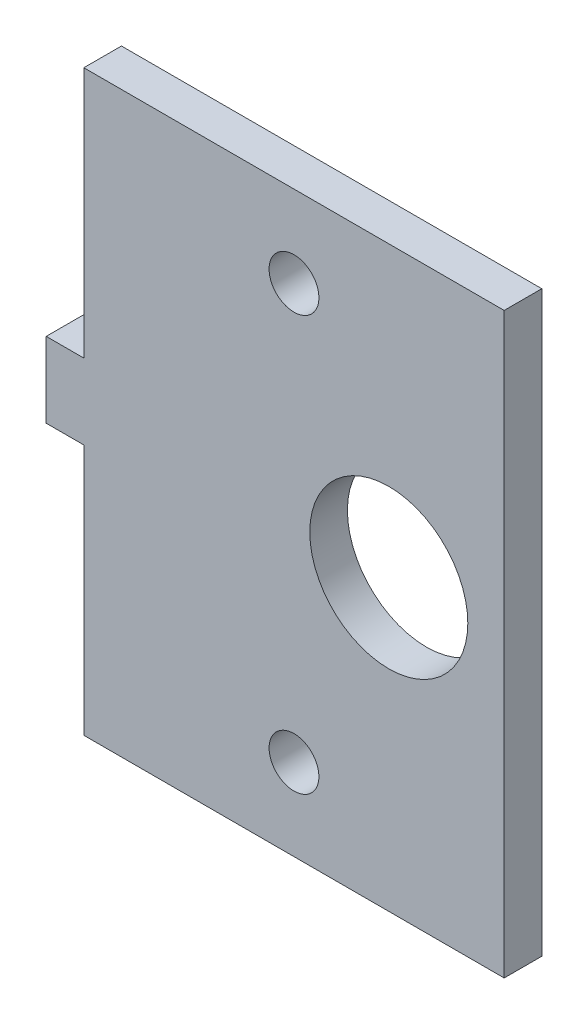
ISO-10303-21;
HEADER;
FILE_DESCRIPTION(('STEP AP214'),'2;1');
FILE_NAME('part.step','',(''),(''),'','','');
FILE_SCHEMA(('AUTOMOTIVE_DESIGN { 1 0 10303 214 1 1 1 1 }'));
ENDSEC;
DATA;
#1=APPLICATION_CONTEXT('core data for automotive mechanical design processes');
#2=APPLICATION_PROTOCOL_DEFINITION('international standard','automotive_design',2000,#1);
#3=PRODUCT_CONTEXT('',#1,'mechanical');
#4=PRODUCT('Part','Part','',(#3));
#5=PRODUCT_RELATED_PRODUCT_CATEGORY('part','',(#4));
#6=PRODUCT_DEFINITION_FORMATION('','',#4);
#7=PRODUCT_DEFINITION_CONTEXT('part definition',#1,'design');
#8=PRODUCT_DEFINITION('design','',#6,#7);
#9=PRODUCT_DEFINITION_SHAPE('','',#8);
#10=(LENGTH_UNIT() NAMED_UNIT(*) SI_UNIT(.MILLI.,.METRE.));
#11=(NAMED_UNIT(*) PLANE_ANGLE_UNIT() SI_UNIT($,.RADIAN.));
#12=(NAMED_UNIT(*) SI_UNIT($,.STERADIAN.) SOLID_ANGLE_UNIT());
#13=UNCERTAINTY_MEASURE_WITH_UNIT(LENGTH_MEASURE(1.E-05),#10,'distance_accuracy_value','');
#14=(GEOMETRIC_REPRESENTATION_CONTEXT(3) GLOBAL_UNCERTAINTY_ASSIGNED_CONTEXT((#13)) GLOBAL_UNIT_ASSIGNED_CONTEXT((#10,
#11,#12)) REPRESENTATION_CONTEXT('',''));
#15=CARTESIAN_POINT('',(0.,0.,0.));
#16=DIRECTION('',(0.,0.,1.));
#17=DIRECTION('',(1.,0.,0.));
#18=AXIS2_PLACEMENT_3D('',#15,#16,#17);
#19=CARTESIAN_POINT('',(-17.736067260239,24.3948339939949,3.175));
#20=DIRECTION('',(1.,0.,0.));
#21=DIRECTION('',(0.,0.,-1.));
#22=AXIS2_PLACEMENT_3D('',#19,#20,#21);
#23=PLANE('',#22);
#24=DIRECTION('',(0.,0.,-1.));
#25=VECTOR('',#24,1.);
#26=CARTESIAN_POINT('',(-17.736067260239,3.175,3.175));
#27=LINE('',#26,#25);
#28=CARTESIAN_POINT('',(-17.736067260239,3.175,3.175));
#29=VERTEX_POINT('',#28);
#30=CARTESIAN_POINT('',(-17.736067260239,3.175,0.));
#31=VERTEX_POINT('',#30);
#32=EDGE_CURVE('E48',#29,#31,#27,.T.);
#33=ORIENTED_EDGE('',*,*,#32,.F.);
#34=DIRECTION('',(0.,-1.,0.));
#35=VECTOR('',#34,1.);
#36=CARTESIAN_POINT('',(-17.736067260239,24.3948339939949,3.175));
#37=LINE('',#36,#35);
#38=CARTESIAN_POINT('',(-17.736067260239,24.3948339939949,3.175));
#39=VERTEX_POINT('',#38);
#40=EDGE_CURVE('E161',#39,#29,#37,.T.);
#41=ORIENTED_EDGE('',*,*,#40,.F.);
#42=DIRECTION('',(0.,0.,-1.));
#43=VECTOR('',#42,1.);
#44=CARTESIAN_POINT('',(-17.736067260239,24.3948339939949,3.175));
#45=LINE('',#44,#43);
#46=CARTESIAN_POINT('',(-17.736067260239,24.3948339939949,0.));
#47=VERTEX_POINT('',#46);
#48=EDGE_CURVE('E41',#39,#47,#45,.T.);
#49=ORIENTED_EDGE('',*,*,#48,.T.);
#50=DIRECTION('',(0.,-1.,0.));
#51=VECTOR('',#50,1.);
#52=CARTESIAN_POINT('',(-17.736067260239,24.3948339939949,0.));
#53=LINE('',#52,#51);
#54=EDGE_CURVE('E170',#47,#31,#53,.T.);
#55=ORIENTED_EDGE('',*,*,#54,.T.);
#56=EDGE_LOOP('',(#33,#41,#49,#55));
#57=FACE_BOUND('',#56,.T.);
#58=ADVANCED_FACE('F33',(#57),#23,.F.);
#59=DIRECTION('',(0.,0.,1.));
#60=VECTOR('',#59,1.);
#61=CARTESIAN_POINT('',(-17.736067260239,-3.175,0.));
#62=LINE('',#61,#60);
#63=CARTESIAN_POINT('',(-17.736067260239,-3.175,0.));
#64=VERTEX_POINT('',#63);
#65=CARTESIAN_POINT('',(-17.736067260239,-3.175,3.175));
#66=VERTEX_POINT('',#65);
#67=EDGE_CURVE('E56',#64,#66,#62,.T.);
#68=ORIENTED_EDGE('',*,*,#67,.F.);
#69=CARTESIAN_POINT('',(-17.736067260239,-24.3948339939949,0.));
#70=VERTEX_POINT('',#69);
#71=EDGE_CURVE('E115',#64,#70,#53,.T.);
#72=ORIENTED_EDGE('',*,*,#71,.T.);
#73=DIRECTION('',(0.,0.,-1.));
#74=VECTOR('',#73,1.);
#75=CARTESIAN_POINT('',(-17.736067260239,-24.3948339939949,3.175));
#76=LINE('',#75,#74);
#77=CARTESIAN_POINT('',(-17.736067260239,-24.3948339939949,3.175));
#78=VERTEX_POINT('',#77);
#79=EDGE_CURVE('E175',#78,#70,#76,.T.);
#80=ORIENTED_EDGE('',*,*,#79,.F.);
#81=EDGE_CURVE('E160',#66,#78,#37,.T.);
#82=ORIENTED_EDGE('',*,*,#81,.F.);
#83=EDGE_LOOP('',(#68,#72,#80,#82));
#84=FACE_BOUND('',#83,.T.);
#85=ADVANCED_FACE('F195',(#84),#23,.F.);
#86=CARTESIAN_POINT('',(17.736067260239,24.3948339939949,3.175));
#87=DIRECTION('',(-1.,0.,0.));
#88=DIRECTION('',(0.,0.,1.));
#89=AXIS2_PLACEMENT_3D('',#86,#87,#88);
#90=PLANE('',#89);
#91=DIRECTION('',(0.,1.,0.));
#92=VECTOR('',#91,1.);
#93=CARTESIAN_POINT('',(17.736067260239,24.3948339939949,0.));
#94=LINE('',#93,#92);
#95=CARTESIAN_POINT('',(17.736067260239,-24.3948339939949,0.));
#96=VERTEX_POINT('',#95);
#97=CARTESIAN_POINT('',(17.736067260239,24.3948339939949,0.));
#98=VERTEX_POINT('',#97);
#99=EDGE_CURVE('E139',#96,#98,#94,.T.);
#100=ORIENTED_EDGE('',*,*,#99,.T.);
#101=DIRECTION('',(0.,0.,-1.));
#102=VECTOR('',#101,1.);
#103=CARTESIAN_POINT('',(17.736067260239,24.3948339939949,3.175));
#104=LINE('',#103,#102);
#105=CARTESIAN_POINT('',(17.736067260239,24.3948339939949,3.175));
#106=VERTEX_POINT('',#105);
#107=EDGE_CURVE('E11',#106,#98,#104,.T.);
#108=ORIENTED_EDGE('',*,*,#107,.F.);
#109=DIRECTION('',(0.,1.,0.));
#110=VECTOR('',#109,1.);
#111=CARTESIAN_POINT('',(17.736067260239,24.3948339939949,3.175));
#112=LINE('',#111,#110);
#113=CARTESIAN_POINT('',(17.736067260239,-24.3948339939949,3.175));
#114=VERTEX_POINT('',#113);
#115=EDGE_CURVE('E154',#114,#106,#112,.T.);
#116=ORIENTED_EDGE('',*,*,#115,.F.);
#117=DIRECTION('',(0.,0.,-1.));
#118=VECTOR('',#117,1.);
#119=CARTESIAN_POINT('',(17.736067260239,-24.3948339939949,3.175));
#120=LINE('',#119,#118);
#121=EDGE_CURVE('E165',#114,#96,#120,.T.);
#122=ORIENTED_EDGE('',*,*,#121,.T.);
#123=EDGE_LOOP('',(#100,#108,#116,#122));
#124=FACE_BOUND('',#123,.T.);
#125=ADVANCED_FACE('F35',(#124),#90,.F.);
#126=CARTESIAN_POINT('',(-17.736067260239,24.3948339939949,3.175));
#127=DIRECTION('',(0.,-1.,0.));
#128=DIRECTION('',(0.,0.,-1.));
#129=AXIS2_PLACEMENT_3D('',#126,#127,#128);
#130=PLANE('',#129);
#131=DIRECTION('',(-1.,0.,0.));
#132=VECTOR('',#131,1.);
#133=CARTESIAN_POINT('',(-17.736067260239,24.3948339939949,0.));
#134=LINE('',#133,#132);
#135=EDGE_CURVE('E168',#98,#47,#134,.T.);
#136=ORIENTED_EDGE('',*,*,#135,.T.);
#137=ORIENTED_EDGE('',*,*,#48,.F.);
#138=DIRECTION('',(-1.,0.,0.));
#139=VECTOR('',#138,1.);
#140=CARTESIAN_POINT('',(-17.736067260239,24.3948339939949,3.175));
#141=LINE('',#140,#139);
#142=EDGE_CURVE('E157',#106,#39,#141,.T.);
#143=ORIENTED_EDGE('',*,*,#142,.F.);
#144=ORIENTED_EDGE('',*,*,#107,.T.);
#145=EDGE_LOOP('',(#136,#137,#143,#144));
#146=FACE_BOUND('',#145,.T.);
#147=ADVANCED_FACE('F188',(#146),#130,.F.);
#148=CARTESIAN_POINT('',(-17.736067260239,-24.3948339939949,3.175));
#149=DIRECTION('',(0.,1.,0.));
#150=DIRECTION('',(0.,0.,1.));
#151=AXIS2_PLACEMENT_3D('',#148,#149,#150);
#152=PLANE('',#151);
#153=DIRECTION('',(1.,0.,0.));
#154=VECTOR('',#153,1.);
#155=CARTESIAN_POINT('',(-17.736067260239,-24.3948339939949,0.));
#156=LINE('',#155,#154);
#157=EDGE_CURVE('E158',#70,#96,#156,.T.);
#158=ORIENTED_EDGE('',*,*,#157,.T.);
#159=ORIENTED_EDGE('',*,*,#121,.F.);
#160=DIRECTION('',(1.,0.,0.));
#161=VECTOR('',#160,1.);
#162=CARTESIAN_POINT('',(-17.736067260239,-24.3948339939949,3.175));
#163=LINE('',#162,#161);
#164=EDGE_CURVE('E163',#78,#114,#163,.T.);
#165=ORIENTED_EDGE('',*,*,#164,.F.);
#166=ORIENTED_EDGE('',*,*,#79,.T.);
#167=EDGE_LOOP('',(#158,#159,#165,#166));
#168=FACE_BOUND('',#167,.T.);
#169=ADVANCED_FACE('F192',(#168),#152,.F.);
#170=CARTESIAN_POINT('',(0.,0.,3.175));
#171=DIRECTION('',(0.,0.,1.));
#172=DIRECTION('',(1.,0.,0.));
#173=AXIS2_PLACEMENT_3D('',#170,#171,#172);
#174=PLANE('',#173);
#175=CARTESIAN_POINT('',(1.2490009027033E-13,17.5,3.175));
#176=DIRECTION('',(0.,0.,-1.));
#177=DIRECTION('',(-1.,0.,0.));
#178=AXIS2_PLACEMENT_3D('',#175,#176,#177);
#179=CIRCLE('',#178,2.10185);
#180=CARTESIAN_POINT('',(-2.10184999999987,17.5,3.175));
#181=VERTEX_POINT('',#180);
#182=EDGE_CURVE('E136',#181,#181,#179,.T.);
#183=ORIENTED_EDGE('',*,*,#182,.T.);
#184=EDGE_LOOP('',(#183));
#185=FACE_BOUND('',#184,.T.);
#186=CARTESIAN_POINT('',(-1.14491749414469E-13,-17.5,3.175));
#187=DIRECTION('',(0.,0.,-1.));
#188=DIRECTION('',(-1.,0.,0.));
#189=AXIS2_PLACEMENT_3D('',#186,#187,#188);
#190=CIRCLE('',#189,2.10185);
#191=CARTESIAN_POINT('',(-2.10185000000012,-17.5,3.175));
#192=VERTEX_POINT('',#191);
#193=EDGE_CURVE('E143',#192,#192,#190,.T.);
#194=ORIENTED_EDGE('',*,*,#193,.T.);
#195=EDGE_LOOP('',(#194));
#196=FACE_BOUND('',#195,.T.);
#197=CARTESIAN_POINT('',(8.,0.,3.175));
#198=DIRECTION('',(0.,0.,-1.));
#199=DIRECTION('',(-1.,0.,0.));
#200=AXIS2_PLACEMENT_3D('',#197,#198,#199);
#201=CIRCLE('',#200,6.6675);
#202=CARTESIAN_POINT('',(1.3325,0.,3.175));
#203=VERTEX_POINT('',#202);
#204=EDGE_CURVE('E149',#203,#203,#201,.T.);
#205=ORIENTED_EDGE('',*,*,#204,.T.);
#206=EDGE_LOOP('',(#205));
#207=FACE_BOUND('',#206,.T.);
#208=ORIENTED_EDGE('',*,*,#115,.T.);
#209=ORIENTED_EDGE('',*,*,#142,.T.);
#210=ORIENTED_EDGE('',*,*,#40,.T.);
#211=DIRECTION('',(1.,0.,0.));
#212=VECTOR('',#211,1.);
#213=CARTESIAN_POINT('',(-20.911067260239,3.175,3.175));
#214=LINE('',#213,#212);
#215=CARTESIAN_POINT('',(-20.911067260239,3.175,3.175));
#216=VERTEX_POINT('',#215);
#217=EDGE_CURVE('E132',#216,#29,#214,.T.);
#218=ORIENTED_EDGE('',*,*,#217,.F.);
#219=DIRECTION('',(0.,1.,0.));
#220=VECTOR('',#219,1.);
#221=CARTESIAN_POINT('',(-20.911067260239,-3.175,3.175));
#222=LINE('',#221,#220);
#223=CARTESIAN_POINT('',(-20.911067260239,-3.175,3.175));
#224=VERTEX_POINT('',#223);
#225=EDGE_CURVE('E123',#224,#216,#222,.T.);
#226=ORIENTED_EDGE('',*,*,#225,.F.);
#227=DIRECTION('',(1.,0.,0.));
#228=VECTOR('',#227,1.);
#229=CARTESIAN_POINT('',(-20.911067260239,-3.175,3.175));
#230=LINE('',#229,#228);
#231=EDGE_CURVE('E118',#224,#66,#230,.T.);
#232=ORIENTED_EDGE('',*,*,#231,.T.);
#233=ORIENTED_EDGE('',*,*,#81,.T.);
#234=ORIENTED_EDGE('',*,*,#164,.T.);
#235=EDGE_LOOP('',(#208,#209,#210,#218,#226,#232,#233,#234));
#236=FACE_BOUND('',#235,.T.);
#237=ADVANCED_FACE('F185',(#185,#196,#207,#236),#174,.T.);
#238=CARTESIAN_POINT('',(0.,0.,0.));
#239=DIRECTION('',(0.,0.,1.));
#240=DIRECTION('',(1.,0.,0.));
#241=AXIS2_PLACEMENT_3D('',#238,#239,#240);
#242=PLANE('',#241);
#243=CARTESIAN_POINT('',(1.2490009027033E-13,17.5,0.));
#244=DIRECTION('',(0.,0.,-1.));
#245=DIRECTION('',(-1.,0.,0.));
#246=AXIS2_PLACEMENT_3D('',#243,#244,#245);
#247=CIRCLE('',#246,2.10185);
#248=CARTESIAN_POINT('',(-2.10184999999987,17.5,0.));
#249=VERTEX_POINT('',#248);
#250=EDGE_CURVE('E140',#249,#249,#247,.T.);
#251=ORIENTED_EDGE('',*,*,#250,.F.);
#252=EDGE_LOOP('',(#251));
#253=FACE_BOUND('',#252,.T.);
#254=CARTESIAN_POINT('',(-1.14491749414469E-13,-17.5,0.));
#255=DIRECTION('',(0.,0.,-1.));
#256=DIRECTION('',(-1.,0.,0.));
#257=AXIS2_PLACEMENT_3D('',#254,#255,#256);
#258=CIRCLE('',#257,2.10185);
#259=CARTESIAN_POINT('',(-2.10185000000012,-17.5,0.));
#260=VERTEX_POINT('',#259);
#261=EDGE_CURVE('E146',#260,#260,#258,.T.);
#262=ORIENTED_EDGE('',*,*,#261,.F.);
#263=EDGE_LOOP('',(#262));
#264=FACE_BOUND('',#263,.T.);
#265=CARTESIAN_POINT('',(8.,0.,0.));
#266=DIRECTION('',(0.,0.,-1.));
#267=DIRECTION('',(-1.,0.,0.));
#268=AXIS2_PLACEMENT_3D('',#265,#266,#267);
#269=CIRCLE('',#268,6.6675);
#270=CARTESIAN_POINT('',(1.3325,0.,0.));
#271=VERTEX_POINT('',#270);
#272=EDGE_CURVE('E117',#271,#271,#269,.T.);
#273=ORIENTED_EDGE('',*,*,#272,.F.);
#274=EDGE_LOOP('',(#273));
#275=FACE_BOUND('',#274,.T.);
#276=ORIENTED_EDGE('',*,*,#99,.F.);
#277=ORIENTED_EDGE('',*,*,#157,.F.);
#278=ORIENTED_EDGE('',*,*,#71,.F.);
#279=DIRECTION('',(1.,0.,0.));
#280=VECTOR('',#279,1.);
#281=CARTESIAN_POINT('',(-20.911067260239,-3.175,0.));
#282=LINE('',#281,#280);
#283=CARTESIAN_POINT('',(-20.911067260239,-3.175,0.));
#284=VERTEX_POINT('',#283);
#285=EDGE_CURVE('E111',#284,#64,#282,.T.);
#286=ORIENTED_EDGE('',*,*,#285,.F.);
#287=DIRECTION('',(0.,-1.,0.));
#288=VECTOR('',#287,1.);
#289=CARTESIAN_POINT('',(-20.911067260239,3.175,0.));
#290=LINE('',#289,#288);
#291=CARTESIAN_POINT('',(-20.911067260239,3.175,0.));
#292=VERTEX_POINT('',#291);
#293=EDGE_CURVE('E98',#292,#284,#290,.T.);
#294=ORIENTED_EDGE('',*,*,#293,.F.);
#295=DIRECTION('',(1.,0.,0.));
#296=VECTOR('',#295,1.);
#297=CARTESIAN_POINT('',(-20.911067260239,3.175,0.));
#298=LINE('',#297,#296);
#299=EDGE_CURVE('E128',#292,#31,#298,.T.);
#300=ORIENTED_EDGE('',*,*,#299,.T.);
#301=ORIENTED_EDGE('',*,*,#54,.F.);
#302=ORIENTED_EDGE('',*,*,#135,.F.);
#303=EDGE_LOOP('',(#276,#277,#278,#286,#294,#300,#301,#302));
#304=FACE_BOUND('',#303,.T.);
#305=ADVANCED_FACE('F113',(#253,#264,#275,#304),#242,.F.);
#306=CARTESIAN_POINT('',(8.,0.,3.175));
#307=DIRECTION('',(0.,0.,-1.));
#308=DIRECTION('',(-1.,0.,0.));
#309=AXIS2_PLACEMENT_3D('',#306,#307,#308);
#310=CYLINDRICAL_SURFACE('',#309,6.6675);
#311=ORIENTED_EDGE('',*,*,#204,.F.);
#312=EDGE_LOOP('',(#311));
#313=FACE_BOUND('',#312,.T.);
#314=ORIENTED_EDGE('',*,*,#272,.T.);
#315=EDGE_LOOP('',(#314));
#316=FACE_BOUND('',#315,.T.);
#317=ADVANCED_FACE('F216',(#313,#316),#310,.F.);
#318=CARTESIAN_POINT('',(-1.14491749414469E-13,-17.5,3.175));
#319=DIRECTION('',(0.,0.,-1.));
#320=DIRECTION('',(-1.,0.,0.));
#321=AXIS2_PLACEMENT_3D('',#318,#319,#320);
#322=CYLINDRICAL_SURFACE('',#321,2.10185);
#323=ORIENTED_EDGE('',*,*,#193,.F.);
#324=EDGE_LOOP('',(#323));
#325=FACE_BOUND('',#324,.T.);
#326=ORIENTED_EDGE('',*,*,#261,.T.);
#327=EDGE_LOOP('',(#326));
#328=FACE_BOUND('',#327,.T.);
#329=ADVANCED_FACE('F222',(#325,#328),#322,.F.);
#330=CARTESIAN_POINT('',(1.2490009027033E-13,17.5,3.175));
#331=DIRECTION('',(0.,0.,-1.));
#332=DIRECTION('',(-1.,0.,0.));
#333=AXIS2_PLACEMENT_3D('',#330,#331,#332);
#334=CYLINDRICAL_SURFACE('',#333,2.10185);
#335=ORIENTED_EDGE('',*,*,#182,.F.);
#336=EDGE_LOOP('',(#335));
#337=FACE_BOUND('',#336,.T.);
#338=ORIENTED_EDGE('',*,*,#250,.T.);
#339=EDGE_LOOP('',(#338));
#340=FACE_BOUND('',#339,.T.);
#341=ADVANCED_FACE('F226',(#337,#340),#334,.F.);
#342=CARTESIAN_POINT('',(-20.911067260239,-3.175,0.));
#343=DIRECTION('',(0.,1.,0.));
#344=DIRECTION('',(0.,0.,1.));
#345=AXIS2_PLACEMENT_3D('',#342,#343,#344);
#346=PLANE('',#345);
#347=ORIENTED_EDGE('',*,*,#67,.T.);
#348=ORIENTED_EDGE('',*,*,#231,.F.);
#349=DIRECTION('',(0.,0.,1.));
#350=VECTOR('',#349,1.);
#351=CARTESIAN_POINT('',(-20.911067260239,-3.175,0.));
#352=LINE('',#351,#350);
#353=EDGE_CURVE('E102',#284,#224,#352,.T.);
#354=ORIENTED_EDGE('',*,*,#353,.F.);
#355=ORIENTED_EDGE('',*,*,#285,.T.);
#356=EDGE_LOOP('',(#347,#348,#354,#355));
#357=FACE_BOUND('',#356,.T.);
#358=ADVANCED_FACE('F120',(#357),#346,.F.);
#359=CARTESIAN_POINT('',(-20.911067260239,3.175,3.175));
#360=DIRECTION('',(0.,-1.,0.));
#361=DIRECTION('',(0.,0.,-1.));
#362=AXIS2_PLACEMENT_3D('',#359,#360,#361);
#363=PLANE('',#362);
#364=ORIENTED_EDGE('',*,*,#32,.T.);
#365=ORIENTED_EDGE('',*,*,#299,.F.);
#366=DIRECTION('',(0.,0.,-1.));
#367=VECTOR('',#366,1.);
#368=CARTESIAN_POINT('',(-20.911067260239,3.175,3.175));
#369=LINE('',#368,#367);
#370=EDGE_CURVE('E105',#216,#292,#369,.T.);
#371=ORIENTED_EDGE('',*,*,#370,.F.);
#372=ORIENTED_EDGE('',*,*,#217,.T.);
#373=EDGE_LOOP('',(#364,#365,#371,#372));
#374=FACE_BOUND('',#373,.T.);
#375=ADVANCED_FACE('F182',(#374),#363,.F.);
#376=CARTESIAN_POINT('',(-20.911067260239,0.,0.));
#377=DIRECTION('',(-1.,0.,0.));
#378=DIRECTION('',(0.,0.,1.));
#379=AXIS2_PLACEMENT_3D('',#376,#377,#378);
#380=PLANE('',#379);
#381=ORIENTED_EDGE('',*,*,#293,.T.);
#382=ORIENTED_EDGE('',*,*,#353,.T.);
#383=ORIENTED_EDGE('',*,*,#225,.T.);
#384=ORIENTED_EDGE('',*,*,#370,.T.);
#385=EDGE_LOOP('',(#381,#382,#383,#384));
#386=FACE_BOUND('',#385,.T.);
#387=ADVANCED_FACE('F100',(#386),#380,.T.);
#388=CLOSED_SHELL('',(#58,#85,#125,#147,#169,#237,#305,#317,#329,#341,#358,#375,#387));
#389=MANIFOLD_SOLID_BREP('B2',#388);
#390=ADVANCED_BREP_SHAPE_REPRESENTATION('',(#18,#389),#14);
#391=SHAPE_DEFINITION_REPRESENTATION(#9,#390);
ENDSEC;
END-ISO-10303-21;
